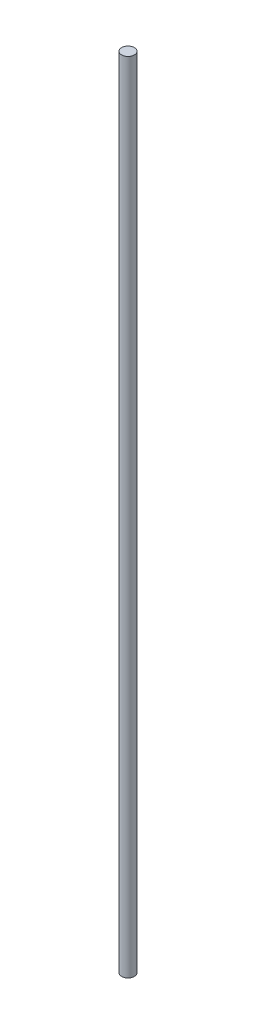
ISO-10303-21;
HEADER;
FILE_DESCRIPTION(('STEP AP214'),'2;1');
FILE_NAME('part.step','',(''),(''),'','','');
FILE_SCHEMA(('AUTOMOTIVE_DESIGN { 1 0 10303 214 1 1 1 1 }'));
ENDSEC;
DATA;
#1=APPLICATION_CONTEXT('core data for automotive mechanical design processes');
#2=APPLICATION_PROTOCOL_DEFINITION('international standard','automotive_design',2000,#1);
#3=PRODUCT_CONTEXT('',#1,'mechanical');
#4=PRODUCT('Part','Part','',(#3));
#5=PRODUCT_RELATED_PRODUCT_CATEGORY('part','',(#4));
#6=PRODUCT_DEFINITION_FORMATION('','',#4);
#7=PRODUCT_DEFINITION_CONTEXT('part definition',#1,'design');
#8=PRODUCT_DEFINITION('design','',#6,#7);
#9=PRODUCT_DEFINITION_SHAPE('','',#8);
#10=(LENGTH_UNIT() NAMED_UNIT(*) SI_UNIT(.MILLI.,.METRE.));
#11=(NAMED_UNIT(*) PLANE_ANGLE_UNIT() SI_UNIT($,.RADIAN.));
#12=(NAMED_UNIT(*) SI_UNIT($,.STERADIAN.) SOLID_ANGLE_UNIT());
#13=UNCERTAINTY_MEASURE_WITH_UNIT(LENGTH_MEASURE(1.E-05),#10,'distance_accuracy_value','');
#14=(GEOMETRIC_REPRESENTATION_CONTEXT(3) GLOBAL_UNCERTAINTY_ASSIGNED_CONTEXT((#13)) GLOBAL_UNIT_ASSIGNED_CONTEXT((#10,
#11,#12)) REPRESENTATION_CONTEXT('',''));
#15=CARTESIAN_POINT('',(0.,0.,0.));
#16=DIRECTION('',(0.,0.,1.));
#17=DIRECTION('',(1.,0.,0.));
#18=AXIS2_PLACEMENT_3D('',#15,#16,#17);
#19=CARTESIAN_POINT('',(0.,250.,0.));
#20=DIRECTION('',(0.,-1.,0.));
#21=DIRECTION('',(0.,0.,-1.));
#22=AXIS2_PLACEMENT_3D('',#19,#20,#21);
#23=CYLINDRICAL_SURFACE('',#22,2.);
#24=CARTESIAN_POINT('',(0.,250.,0.));
#25=DIRECTION('',(0.,1.,0.));
#26=DIRECTION('',(0.,0.,1.));
#27=AXIS2_PLACEMENT_3D('',#24,#25,#26);
#28=CIRCLE('',#27,2.);
#29=CARTESIAN_POINT('',(0.,250.,2.));
#30=VERTEX_POINT('',#29);
#31=EDGE_CURVE('E10',#30,#30,#28,.T.);
#32=ORIENTED_EDGE('',*,*,#31,.F.);
#33=EDGE_LOOP('',(#32));
#34=FACE_BOUND('',#33,.T.);
#35=CARTESIAN_POINT('',(0.,0.,0.));
#36=DIRECTION('',(0.,1.,0.));
#37=DIRECTION('',(0.,0.,1.));
#38=AXIS2_PLACEMENT_3D('',#35,#36,#37);
#39=CIRCLE('',#38,2.);
#40=CARTESIAN_POINT('',(0.,0.,2.));
#41=VERTEX_POINT('',#40);
#42=EDGE_CURVE('E38',#41,#41,#39,.T.);
#43=ORIENTED_EDGE('',*,*,#42,.T.);
#44=EDGE_LOOP('',(#43));
#45=FACE_BOUND('',#44,.T.);
#46=ADVANCED_FACE('F35',(#34,#45),#23,.T.);
#47=CARTESIAN_POINT('',(0.,250.,0.));
#48=DIRECTION('',(0.,1.,0.));
#49=DIRECTION('',(0.,0.,1.));
#50=AXIS2_PLACEMENT_3D('',#47,#48,#49);
#51=PLANE('',#50);
#52=ORIENTED_EDGE('',*,*,#31,.T.);
#53=EDGE_LOOP('',(#52));
#54=FACE_BOUND('',#53,.T.);
#55=ADVANCED_FACE('F50',(#54),#51,.T.);
#56=CARTESIAN_POINT('',(0.,0.,0.));
#57=DIRECTION('',(0.,1.,0.));
#58=DIRECTION('',(0.,0.,1.));
#59=AXIS2_PLACEMENT_3D('',#56,#57,#58);
#60=PLANE('',#59);
#61=ORIENTED_EDGE('',*,*,#42,.F.);
#62=EDGE_LOOP('',(#61));
#63=FACE_BOUND('',#62,.T.);
#64=ADVANCED_FACE('F48',(#63),#60,.F.);
#65=CLOSED_SHELL('',(#46,#55,#64));
#66=MANIFOLD_SOLID_BREP('B2',#65);
#67=ADVANCED_BREP_SHAPE_REPRESENTATION('',(#18,#66),#14);
#68=SHAPE_DEFINITION_REPRESENTATION(#9,#67);
ENDSEC;
END-ISO-10303-21;
